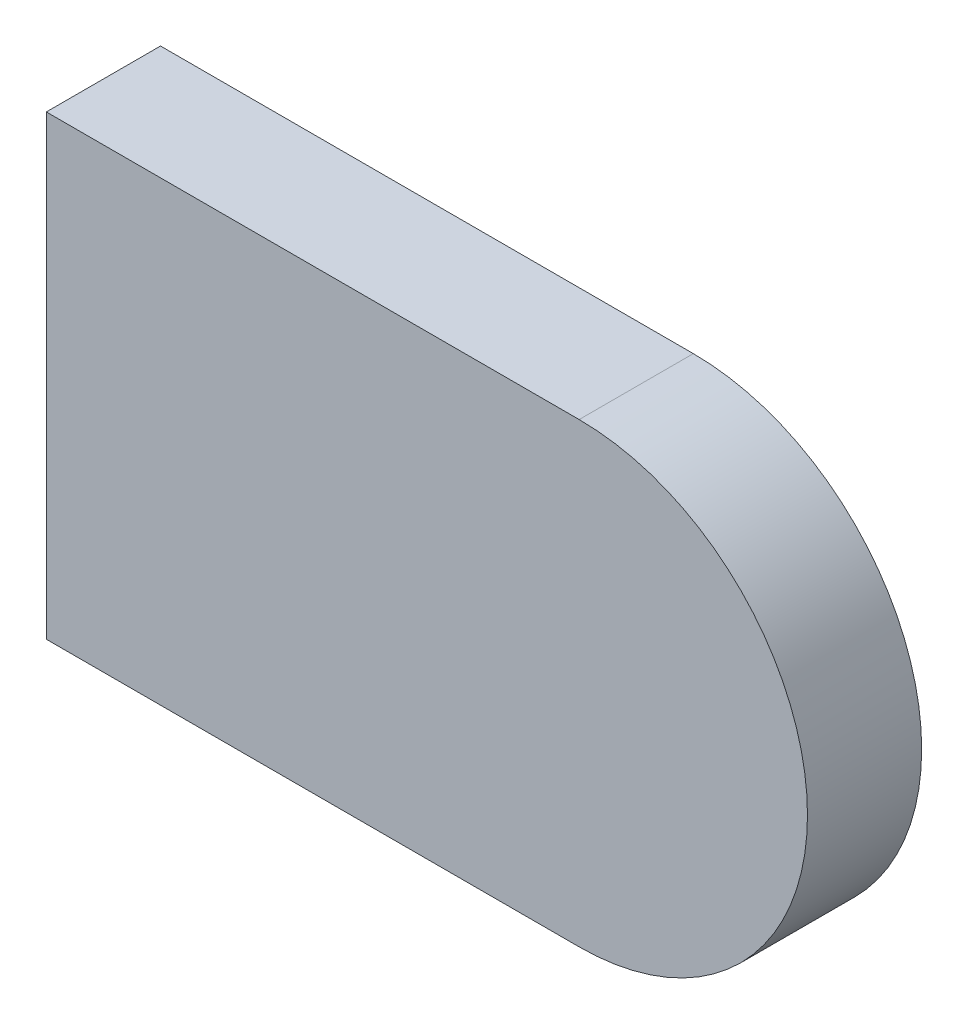
ISO-10303-21;
HEADER;
FILE_DESCRIPTION(('STEP AP214'),'2;1');
FILE_NAME('part.step','',(''),(''),'','','');
FILE_SCHEMA(('AUTOMOTIVE_DESIGN { 1 0 10303 214 1 1 1 1 }'));
ENDSEC;
DATA;
#1=APPLICATION_CONTEXT('core data for automotive mechanical design processes');
#2=APPLICATION_PROTOCOL_DEFINITION('international standard','automotive_design',2000,#1);
#3=PRODUCT_CONTEXT('',#1,'mechanical');
#4=PRODUCT('Part','Part','',(#3));
#5=PRODUCT_RELATED_PRODUCT_CATEGORY('part','',(#4));
#6=PRODUCT_DEFINITION_FORMATION('','',#4);
#7=PRODUCT_DEFINITION_CONTEXT('part definition',#1,'design');
#8=PRODUCT_DEFINITION('design','',#6,#7);
#9=PRODUCT_DEFINITION_SHAPE('','',#8);
#10=(LENGTH_UNIT() NAMED_UNIT(*) SI_UNIT(.MILLI.,.METRE.));
#11=(NAMED_UNIT(*) PLANE_ANGLE_UNIT() SI_UNIT($,.RADIAN.));
#12=(NAMED_UNIT(*) SI_UNIT($,.STERADIAN.) SOLID_ANGLE_UNIT());
#13=UNCERTAINTY_MEASURE_WITH_UNIT(LENGTH_MEASURE(1.E-05),#10,'distance_accuracy_value','');
#14=(GEOMETRIC_REPRESENTATION_CONTEXT(3) GLOBAL_UNCERTAINTY_ASSIGNED_CONTEXT((#13)) GLOBAL_UNIT_ASSIGNED_CONTEXT((#10,
#11,#12)) REPRESENTATION_CONTEXT('',''));
#15=CARTESIAN_POINT('',(0.,0.,0.));
#16=DIRECTION('',(0.,0.,1.));
#17=DIRECTION('',(1.,0.,0.));
#18=AXIS2_PLACEMENT_3D('',#15,#16,#17);
#19=CARTESIAN_POINT('',(0.,0.,19.05));
#20=DIRECTION('',(1.,0.,0.));
#21=DIRECTION('',(0.,0.,-1.));
#22=AXIS2_PLACEMENT_3D('',#19,#20,#21);
#23=PLANE('',#22);
#24=DIRECTION('',(0.,-1.,0.));
#25=VECTOR('',#24,1.);
#26=CARTESIAN_POINT('',(0.,0.,0.));
#27=LINE('',#26,#25);
#28=CARTESIAN_POINT('',(0.,76.1999999994032,0.));
#29=VERTEX_POINT('',#28);
#30=CARTESIAN_POINT('',(0.,0.,0.));
#31=VERTEX_POINT('',#30);
#32=EDGE_CURVE('E96',#29,#31,#27,.T.);
#33=ORIENTED_EDGE('',*,*,#32,.T.);
#34=DIRECTION('',(0.,0.,-1.));
#35=VECTOR('',#34,1.);
#36=CARTESIAN_POINT('',(0.,0.,19.05));
#37=LINE('',#36,#35);
#38=CARTESIAN_POINT('',(0.,0.,19.05));
#39=VERTEX_POINT('',#38);
#40=EDGE_CURVE('E11',#39,#31,#37,.T.);
#41=ORIENTED_EDGE('',*,*,#40,.F.);
#42=DIRECTION('',(0.,-1.,0.));
#43=VECTOR('',#42,1.);
#44=CARTESIAN_POINT('',(0.,0.,19.05));
#45=LINE('',#44,#43);
#46=CARTESIAN_POINT('',(0.,76.1999999994032,19.05));
#47=VERTEX_POINT('',#46);
#48=EDGE_CURVE('E83',#47,#39,#45,.T.);
#49=ORIENTED_EDGE('',*,*,#48,.F.);
#50=DIRECTION('',(0.,0.,-1.));
#51=VECTOR('',#50,1.);
#52=CARTESIAN_POINT('',(0.,76.1999999994032,19.05));
#53=LINE('',#52,#51);
#54=EDGE_CURVE('E92',#47,#29,#53,.T.);
#55=ORIENTED_EDGE('',*,*,#54,.T.);
#56=EDGE_LOOP('',(#33,#41,#49,#55));
#57=FACE_BOUND('',#56,.T.);
#58=ADVANCED_FACE('F33',(#57),#23,.F.);
#59=CARTESIAN_POINT('',(0.,0.,19.05));
#60=DIRECTION('',(0.,1.,0.));
#61=DIRECTION('',(0.,0.,1.));
#62=AXIS2_PLACEMENT_3D('',#59,#60,#61);
#63=PLANE('',#62);
#64=DIRECTION('',(1.,0.,0.));
#65=VECTOR('',#64,1.);
#66=CARTESIAN_POINT('',(0.,0.,0.));
#67=LINE('',#66,#65);
#68=CARTESIAN_POINT('',(88.9033561436629,0.,0.));
#69=VERTEX_POINT('',#68);
#70=EDGE_CURVE('E88',#31,#69,#67,.T.);
#71=ORIENTED_EDGE('',*,*,#70,.T.);
#72=DIRECTION('',(0.,0.,-1.));
#73=VECTOR('',#72,1.);
#74=CARTESIAN_POINT('',(88.9033561436629,0.,19.05));
#75=LINE('',#74,#73);
#76=CARTESIAN_POINT('',(88.9033561436629,0.,19.05));
#77=VERTEX_POINT('',#76);
#78=EDGE_CURVE('E41',#77,#69,#75,.T.);
#79=ORIENTED_EDGE('',*,*,#78,.F.);
#80=DIRECTION('',(1.,0.,0.));
#81=VECTOR('',#80,1.);
#82=CARTESIAN_POINT('',(0.,0.,19.05));
#83=LINE('',#82,#81);
#84=EDGE_CURVE('E78',#39,#77,#83,.T.);
#85=ORIENTED_EDGE('',*,*,#84,.F.);
#86=ORIENTED_EDGE('',*,*,#40,.T.);
#87=EDGE_LOOP('',(#71,#79,#85,#86));
#88=FACE_BOUND('',#87,.T.);
#89=ADVANCED_FACE('F87',(#88),#63,.F.);
#90=CARTESIAN_POINT('',(88.8966250915272,38.1000002770543,19.05));
#91=DIRECTION('',(0.,0.,-1.));
#92=DIRECTION('',(-1.,0.,0.));
#93=AXIS2_PLACEMENT_3D('',#90,#91,#92);
#94=CYLINDRICAL_SURFACE('',#93,38.1000001947164);
#95=CARTESIAN_POINT('',(88.8966250915272,38.1000002770543,0.));
#96=DIRECTION('',(0.,0.,1.));
#97=DIRECTION('',(-1.,0.,0.));
#98=AXIS2_PLACEMENT_3D('',#95,#96,#97);
#99=CIRCLE('',#98,38.1000001947164);
#100=CARTESIAN_POINT('',(88.9000000000286,76.2000003222956,0.));
#101=VERTEX_POINT('',#100);
#102=EDGE_CURVE('E65',#69,#101,#99,.T.);
#103=ORIENTED_EDGE('',*,*,#102,.T.);
#104=DIRECTION('',(0.,0.,-1.));
#105=VECTOR('',#104,1.);
#106=CARTESIAN_POINT('',(88.9000000000286,76.2000003222956,19.05));
#107=LINE('',#106,#105);
#108=CARTESIAN_POINT('',(88.9000000000286,76.2000003222956,19.05));
#109=VERTEX_POINT('',#108);
#110=EDGE_CURVE('E89',#109,#101,#107,.T.);
#111=ORIENTED_EDGE('',*,*,#110,.F.);
#112=CARTESIAN_POINT('',(88.8966240912959,38.1000002772622,19.05));
#113=DIRECTION('',(0.,0.,1.));
#114=DIRECTION('',(-1.,0.,0.));
#115=AXIS2_PLACEMENT_3D('',#112,#113,#114);
#116=CIRCLE('',#115,38.1000011949299);
#117=EDGE_CURVE('E81',#77,#109,#116,.T.);
#118=ORIENTED_EDGE('',*,*,#117,.F.);
#119=ORIENTED_EDGE('',*,*,#78,.T.);
#120=EDGE_LOOP('',(#103,#111,#118,#119));
#121=FACE_BOUND('',#120,.T.);
#122=ADVANCED_FACE('F90',(#121),#94,.T.);
#123=CARTESIAN_POINT('',(0.,76.1999999994032,19.05));
#124=DIRECTION('',(0.,-1.,0.));
#125=DIRECTION('',(0.,0.,-1.));
#126=AXIS2_PLACEMENT_3D('',#123,#124,#125);
#127=PLANE('',#126);
#128=DIRECTION('',(-1.,0.,0.));
#129=VECTOR('',#128,1.);
#130=CARTESIAN_POINT('',(0.,76.1999999994032,0.));
#131=LINE('',#130,#129);
#132=EDGE_CURVE('E71',#101,#29,#131,.T.);
#133=ORIENTED_EDGE('',*,*,#132,.T.);
#134=ORIENTED_EDGE('',*,*,#54,.F.);
#135=DIRECTION('',(-1.,0.,0.));
#136=VECTOR('',#135,1.);
#137=CARTESIAN_POINT('',(0.,76.1999999994032,19.05));
#138=LINE('',#137,#136);
#139=EDGE_CURVE('E49',#109,#47,#138,.T.);
#140=ORIENTED_EDGE('',*,*,#139,.F.);
#141=ORIENTED_EDGE('',*,*,#110,.T.);
#142=EDGE_LOOP('',(#133,#134,#140,#141));
#143=FACE_BOUND('',#142,.T.);
#144=ADVANCED_FACE('F103',(#143),#127,.F.);
#145=CARTESIAN_POINT('',(88.8966250915272,38.1000002770543,19.05));
#146=DIRECTION('',(0.,0.,-1.));
#147=DIRECTION('',(-1.,0.,0.));
#148=AXIS2_PLACEMENT_3D('',#145,#146,#147);
#149=PLANE('',#148);
#150=ORIENTED_EDGE('',*,*,#48,.T.);
#151=ORIENTED_EDGE('',*,*,#84,.T.);
#152=ORIENTED_EDGE('',*,*,#117,.T.);
#153=ORIENTED_EDGE('',*,*,#139,.T.);
#154=EDGE_LOOP('',(#150,#151,#152,#153));
#155=FACE_BOUND('',#154,.T.);
#156=ADVANCED_FACE('F79',(#155),#149,.F.);
#157=CARTESIAN_POINT('',(88.8966250915272,38.1000002770543,0.));
#158=DIRECTION('',(0.,0.,-1.));
#159=DIRECTION('',(-1.,0.,0.));
#160=AXIS2_PLACEMENT_3D('',#157,#158,#159);
#161=PLANE('',#160);
#162=ORIENTED_EDGE('',*,*,#32,.F.);
#163=ORIENTED_EDGE('',*,*,#132,.F.);
#164=ORIENTED_EDGE('',*,*,#102,.F.);
#165=ORIENTED_EDGE('',*,*,#70,.F.);
#166=EDGE_LOOP('',(#162,#163,#164,#165));
#167=FACE_BOUND('',#166,.T.);
#168=ADVANCED_FACE('F106',(#167),#161,.T.);
#169=CLOSED_SHELL('',(#58,#89,#122,#144,#156,#168));
#170=MANIFOLD_SOLID_BREP('B2',#169);
#171=ADVANCED_BREP_SHAPE_REPRESENTATION('',(#18,#170),#14);
#172=SHAPE_DEFINITION_REPRESENTATION(#9,#171);
ENDSEC;
END-ISO-10303-21;
